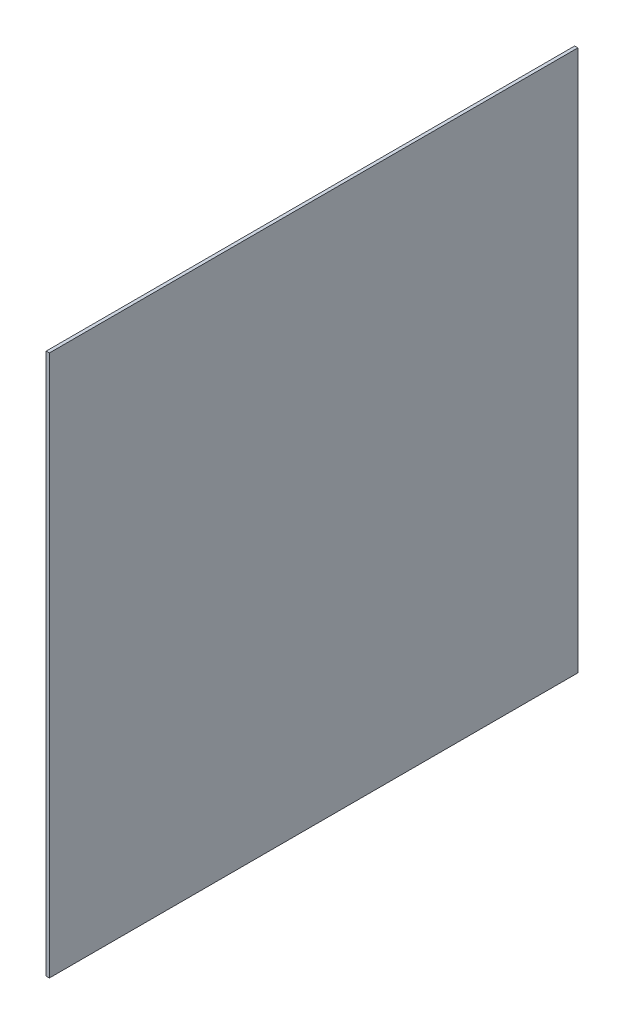
ISO-10303-21;
HEADER;
FILE_DESCRIPTION(('STEP AP214'),'2;1');
FILE_NAME('part.step','',(''),(''),'','','');
FILE_SCHEMA(('AUTOMOTIVE_DESIGN { 1 0 10303 214 1 1 1 1 }'));
ENDSEC;
DATA;
#1=APPLICATION_CONTEXT('core data for automotive mechanical design processes');
#2=APPLICATION_PROTOCOL_DEFINITION('international standard','automotive_design',2000,#1);
#3=PRODUCT_CONTEXT('',#1,'mechanical');
#4=PRODUCT('Part','Part','',(#3));
#5=PRODUCT_RELATED_PRODUCT_CATEGORY('part','',(#4));
#6=PRODUCT_DEFINITION_FORMATION('','',#4);
#7=PRODUCT_DEFINITION_CONTEXT('part definition',#1,'design');
#8=PRODUCT_DEFINITION('design','',#6,#7);
#9=PRODUCT_DEFINITION_SHAPE('','',#8);
#10=(LENGTH_UNIT() NAMED_UNIT(*) SI_UNIT(.MILLI.,.METRE.));
#11=(NAMED_UNIT(*) PLANE_ANGLE_UNIT() SI_UNIT($,.RADIAN.));
#12=(NAMED_UNIT(*) SI_UNIT($,.STERADIAN.) SOLID_ANGLE_UNIT());
#13=UNCERTAINTY_MEASURE_WITH_UNIT(LENGTH_MEASURE(1.E-05),#10,'distance_accuracy_value','');
#14=(GEOMETRIC_REPRESENTATION_CONTEXT(3) GLOBAL_UNCERTAINTY_ASSIGNED_CONTEXT((#13)) GLOBAL_UNIT_ASSIGNED_CONTEXT((#10,
#11,#12)) REPRESENTATION_CONTEXT('',''));
#15=CARTESIAN_POINT('',(0.,0.,0.));
#16=DIRECTION('',(0.,0.,1.));
#17=DIRECTION('',(1.,0.,0.));
#18=AXIS2_PLACEMENT_3D('',#15,#16,#17);
#19=CARTESIAN_POINT('',(12.7,0.,0.));
#20=DIRECTION('',(0.,0.,-1.));
#21=DIRECTION('',(-1.,0.,0.));
#22=AXIS2_PLACEMENT_3D('',#19,#20,#21);
#23=PLANE('',#22);
#24=DIRECTION('',(0.,-1.,0.));
#25=VECTOR('',#24,1.);
#26=CARTESIAN_POINT('',(0.,0.,0.));
#27=LINE('',#26,#25);
#28=CARTESIAN_POINT('',(0.,2133.6,0.));
#29=VERTEX_POINT('',#28);
#30=CARTESIAN_POINT('',(0.,0.,0.));
#31=VERTEX_POINT('',#30);
#32=EDGE_CURVE('E107',#29,#31,#27,.T.);
#33=ORIENTED_EDGE('',*,*,#32,.T.);
#34=DIRECTION('',(-1.,0.,0.));
#35=VECTOR('',#34,1.);
#36=CARTESIAN_POINT('',(12.7,0.,0.));
#37=LINE('',#36,#35);
#38=CARTESIAN_POINT('',(12.7,0.,0.));
#39=VERTEX_POINT('',#38);
#40=EDGE_CURVE('E11',#39,#31,#37,.T.);
#41=ORIENTED_EDGE('',*,*,#40,.F.);
#42=DIRECTION('',(0.,-1.,0.));
#43=VECTOR('',#42,1.);
#44=CARTESIAN_POINT('',(12.7,0.,0.));
#45=LINE('',#44,#43);
#46=CARTESIAN_POINT('',(12.7,2133.6,0.));
#47=VERTEX_POINT('',#46);
#48=EDGE_CURVE('E91',#47,#39,#45,.T.);
#49=ORIENTED_EDGE('',*,*,#48,.F.);
#50=DIRECTION('',(-1.,0.,0.));
#51=VECTOR('',#50,1.);
#52=CARTESIAN_POINT('',(12.7,2133.6,0.));
#53=LINE('',#52,#51);
#54=EDGE_CURVE('E103',#47,#29,#53,.T.);
#55=ORIENTED_EDGE('',*,*,#54,.T.);
#56=EDGE_LOOP('',(#33,#41,#49,#55));
#57=FACE_BOUND('',#56,.T.);
#58=ADVANCED_FACE('F39',(#57),#23,.F.);
#59=CARTESIAN_POINT('',(12.7,0.,0.));
#60=DIRECTION('',(0.,1.,0.));
#61=DIRECTION('',(0.,0.,1.));
#62=AXIS2_PLACEMENT_3D('',#59,#60,#61);
#63=PLANE('',#62);
#64=DIRECTION('',(0.,0.,-1.));
#65=VECTOR('',#64,1.);
#66=CARTESIAN_POINT('',(0.,0.,0.));
#67=LINE('',#66,#65);
#68=CARTESIAN_POINT('',(0.,0.,-2082.8));
#69=VERTEX_POINT('',#68);
#70=EDGE_CURVE('E96',#31,#69,#67,.T.);
#71=ORIENTED_EDGE('',*,*,#70,.T.);
#72=DIRECTION('',(-1.,0.,0.));
#73=VECTOR('',#72,1.);
#74=CARTESIAN_POINT('',(12.7,0.,-2082.8));
#75=LINE('',#74,#73);
#76=CARTESIAN_POINT('',(12.7,0.,-2082.8));
#77=VERTEX_POINT('',#76);
#78=EDGE_CURVE('E48',#77,#69,#75,.T.);
#79=ORIENTED_EDGE('',*,*,#78,.F.);
#80=DIRECTION('',(0.,0.,-1.));
#81=VECTOR('',#80,1.);
#82=CARTESIAN_POINT('',(12.7,0.,0.));
#83=LINE('',#82,#81);
#84=EDGE_CURVE('E86',#39,#77,#83,.T.);
#85=ORIENTED_EDGE('',*,*,#84,.F.);
#86=ORIENTED_EDGE('',*,*,#40,.T.);
#87=EDGE_LOOP('',(#71,#79,#85,#86));
#88=FACE_BOUND('',#87,.T.);
#89=ADVANCED_FACE('F95',(#88),#63,.F.);
#90=CARTESIAN_POINT('',(12.7,0.,-2082.8));
#91=DIRECTION('',(0.,0.,1.));
#92=DIRECTION('',(1.,0.,0.));
#93=AXIS2_PLACEMENT_3D('',#90,#91,#92);
#94=PLANE('',#93);
#95=DIRECTION('',(0.,1.,0.));
#96=VECTOR('',#95,1.);
#97=CARTESIAN_POINT('',(0.,0.,-2082.8));
#98=LINE('',#97,#96);
#99=CARTESIAN_POINT('',(0.,2133.6,-2082.8));
#100=VERTEX_POINT('',#99);
#101=EDGE_CURVE('E73',#69,#100,#98,.T.);
#102=ORIENTED_EDGE('',*,*,#101,.T.);
#103=DIRECTION('',(-1.,0.,0.));
#104=VECTOR('',#103,1.);
#105=CARTESIAN_POINT('',(12.7,2133.6,-2082.8));
#106=LINE('',#105,#104);
#107=CARTESIAN_POINT('',(12.7,2133.6,-2082.8));
#108=VERTEX_POINT('',#107);
#109=EDGE_CURVE('E98',#108,#100,#106,.T.);
#110=ORIENTED_EDGE('',*,*,#109,.F.);
#111=DIRECTION('',(0.,1.,0.));
#112=VECTOR('',#111,1.);
#113=CARTESIAN_POINT('',(12.7,0.,-2082.8));
#114=LINE('',#113,#112);
#115=EDGE_CURVE('E89',#77,#108,#114,.T.);
#116=ORIENTED_EDGE('',*,*,#115,.F.);
#117=ORIENTED_EDGE('',*,*,#78,.T.);
#118=EDGE_LOOP('',(#102,#110,#116,#117));
#119=FACE_BOUND('',#118,.T.);
#120=ADVANCED_FACE('F99',(#119),#94,.F.);
#121=CARTESIAN_POINT('',(12.7,2133.6,0.));
#122=DIRECTION('',(0.,-1.,0.));
#123=DIRECTION('',(0.,0.,-1.));
#124=AXIS2_PLACEMENT_3D('',#121,#122,#123);
#125=PLANE('',#124);
#126=DIRECTION('',(0.,0.,1.));
#127=VECTOR('',#126,1.);
#128=CARTESIAN_POINT('',(0.,2133.6,0.));
#129=LINE('',#128,#127);
#130=EDGE_CURVE('E79',#100,#29,#129,.T.);
#131=ORIENTED_EDGE('',*,*,#130,.T.);
#132=ORIENTED_EDGE('',*,*,#54,.F.);
#133=DIRECTION('',(0.,0.,1.));
#134=VECTOR('',#133,1.);
#135=CARTESIAN_POINT('',(12.7,2133.6,0.));
#136=LINE('',#135,#134);
#137=EDGE_CURVE('E56',#108,#47,#136,.T.);
#138=ORIENTED_EDGE('',*,*,#137,.F.);
#139=ORIENTED_EDGE('',*,*,#109,.T.);
#140=EDGE_LOOP('',(#131,#132,#138,#139));
#141=FACE_BOUND('',#140,.T.);
#142=ADVANCED_FACE('F120',(#141),#125,.F.);
#143=CARTESIAN_POINT('',(12.7,0.,0.));
#144=DIRECTION('',(-1.,0.,0.));
#145=DIRECTION('',(0.,0.,1.));
#146=AXIS2_PLACEMENT_3D('',#143,#144,#145);
#147=PLANE('',#146);
#148=ORIENTED_EDGE('',*,*,#48,.T.);
#149=ORIENTED_EDGE('',*,*,#84,.T.);
#150=ORIENTED_EDGE('',*,*,#115,.T.);
#151=ORIENTED_EDGE('',*,*,#137,.T.);
#152=EDGE_LOOP('',(#148,#149,#150,#151));
#153=FACE_BOUND('',#152,.T.);
#154=ADVANCED_FACE('F87',(#153),#147,.F.);
#155=CARTESIAN_POINT('',(0.,0.,0.));
#156=DIRECTION('',(-1.,0.,0.));
#157=DIRECTION('',(0.,0.,1.));
#158=AXIS2_PLACEMENT_3D('',#155,#156,#157);
#159=PLANE('',#158);
#160=ORIENTED_EDGE('',*,*,#32,.F.);
#161=ORIENTED_EDGE('',*,*,#130,.F.);
#162=ORIENTED_EDGE('',*,*,#101,.F.);
#163=ORIENTED_EDGE('',*,*,#70,.F.);
#164=EDGE_LOOP('',(#160,#161,#162,#163));
#165=FACE_BOUND('',#164,.T.);
#166=ADVANCED_FACE('F123',(#165),#159,.T.);
#167=CLOSED_SHELL('',(#58,#89,#120,#142,#154,#166));
#168=MANIFOLD_SOLID_BREP('B2',#167);
#169=ADVANCED_BREP_SHAPE_REPRESENTATION('',(#18,#168),#14);
#170=SHAPE_DEFINITION_REPRESENTATION(#9,#169);
ENDSEC;
END-ISO-10303-21;
